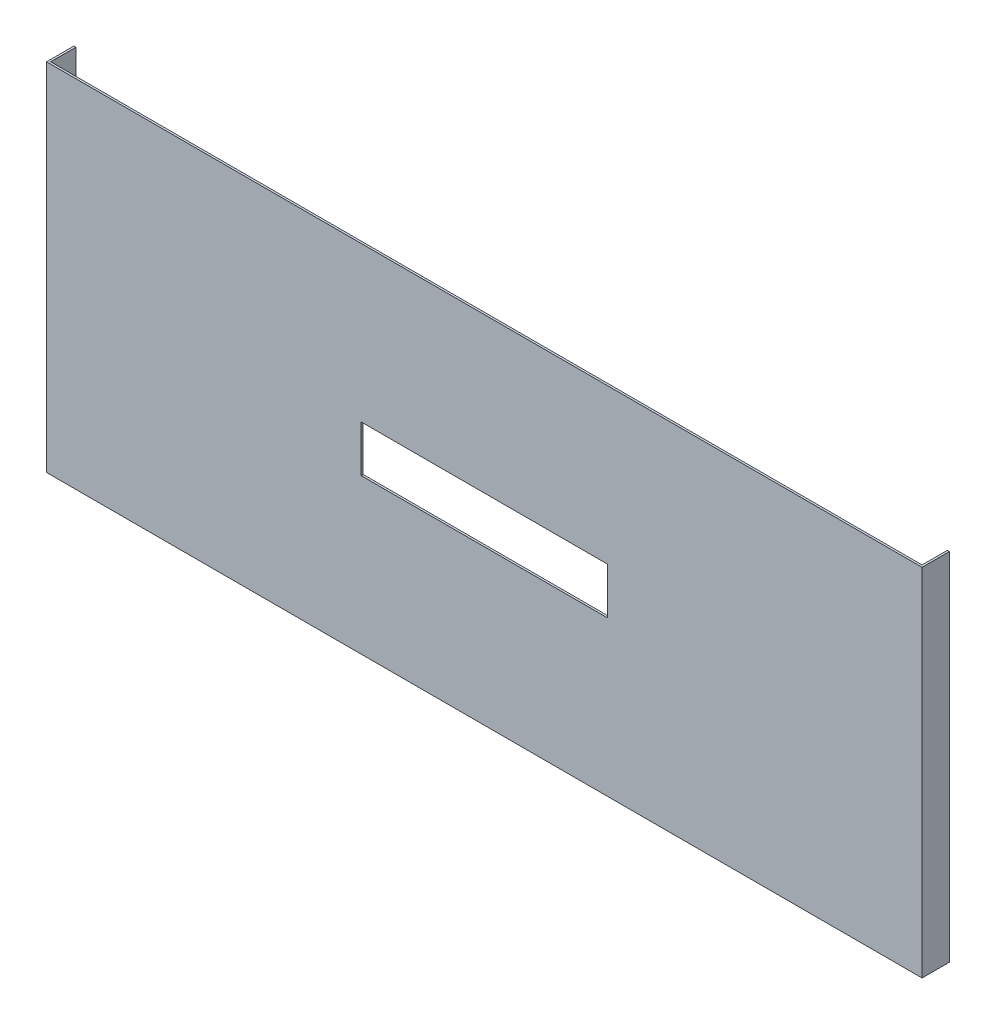
ISO-10303-21;
HEADER;
FILE_DESCRIPTION(('STEP AP214'),'2;1');
FILE_NAME('part.step','',(''),(''),'','','');
FILE_SCHEMA(('AUTOMOTIVE_DESIGN { 1 0 10303 214 1 1 1 1 }'));
ENDSEC;
DATA;
#1=APPLICATION_CONTEXT('core data for automotive mechanical design processes');
#2=APPLICATION_PROTOCOL_DEFINITION('international standard','automotive_design',2000,#1);
#3=PRODUCT_CONTEXT('',#1,'mechanical');
#4=PRODUCT('Part','Part','',(#3));
#5=PRODUCT_RELATED_PRODUCT_CATEGORY('part','',(#4));
#6=PRODUCT_DEFINITION_FORMATION('','',#4);
#7=PRODUCT_DEFINITION_CONTEXT('part definition',#1,'design');
#8=PRODUCT_DEFINITION('design','',#6,#7);
#9=PRODUCT_DEFINITION_SHAPE('','',#8);
#10=(LENGTH_UNIT() NAMED_UNIT(*) SI_UNIT(.MILLI.,.METRE.));
#11=(NAMED_UNIT(*) PLANE_ANGLE_UNIT() SI_UNIT($,.RADIAN.));
#12=(NAMED_UNIT(*) SI_UNIT($,.STERADIAN.) SOLID_ANGLE_UNIT());
#13=UNCERTAINTY_MEASURE_WITH_UNIT(LENGTH_MEASURE(1.E-05),#10,'distance_accuracy_value','');
#14=(GEOMETRIC_REPRESENTATION_CONTEXT(3) GLOBAL_UNCERTAINTY_ASSIGNED_CONTEXT((#13)) GLOBAL_UNIT_ASSIGNED_CONTEXT((#10,
#11,#12)) REPRESENTATION_CONTEXT('',''));
#15=CARTESIAN_POINT('',(0.,0.,0.));
#16=DIRECTION('',(0.,0.,1.));
#17=DIRECTION('',(1.,0.,0.));
#18=AXIS2_PLACEMENT_3D('',#15,#16,#17);
#19=CARTESIAN_POINT('',(670.,460.,40.));
#20=DIRECTION('',(0.,0.,-1.));
#21=DIRECTION('',(-1.,0.,0.));
#22=AXIS2_PLACEMENT_3D('',#19,#20,#21);
#23=PLANE('',#22);
#24=DIRECTION('',(1.,0.,0.));
#25=VECTOR('',#24,1.);
#26=CARTESIAN_POINT('',(670.,200.,40.));
#27=LINE('',#26,#25);
#28=CARTESIAN_POINT('',(30.,200.,40.));
#29=VERTEX_POINT('',#28);
#30=CARTESIAN_POINT('',(670.,200.,40.));
#31=VERTEX_POINT('',#30);
#32=EDGE_CURVE('E141',#29,#31,#27,.T.);
#33=ORIENTED_EDGE('',*,*,#32,.T.);
#34=DIRECTION('',(0.,-1.,0.));
#35=VECTOR('',#34,1.);
#36=CARTESIAN_POINT('',(670.,460.,40.));
#37=LINE('',#36,#35);
#38=CARTESIAN_POINT('',(670.,460.,40.));
#39=VERTEX_POINT('',#38);
#40=EDGE_CURVE('E200',#39,#31,#37,.T.);
#41=ORIENTED_EDGE('',*,*,#40,.F.);
#42=DIRECTION('',(1.,0.,0.));
#43=VECTOR('',#42,1.);
#44=CARTESIAN_POINT('',(670.,460.,40.));
#45=LINE('',#44,#43);
#46=CARTESIAN_POINT('',(30.,460.,40.));
#47=VERTEX_POINT('',#46);
#48=EDGE_CURVE('E149',#47,#39,#45,.T.);
#49=ORIENTED_EDGE('',*,*,#48,.F.);
#50=DIRECTION('',(0.,-1.,0.));
#51=VECTOR('',#50,1.);
#52=CARTESIAN_POINT('',(30.,460.,40.));
#53=LINE('',#52,#51);
#54=EDGE_CURVE('E166',#47,#29,#53,.T.);
#55=ORIENTED_EDGE('',*,*,#54,.T.);
#56=EDGE_LOOP('',(#33,#41,#49,#55));
#57=FACE_BOUND('',#56,.T.);
#58=DIRECTION('',(0.,-1.,0.));
#59=VECTOR('',#58,1.);
#60=CARTESIAN_POINT('',(260.,460.,40.));
#61=LINE('',#60,#59);
#62=CARTESIAN_POINT('',(260.,347.,40.));
#63=VERTEX_POINT('',#62);
#64=CARTESIAN_POINT('',(260.,313.,40.));
#65=VERTEX_POINT('',#64);
#66=EDGE_CURVE('E134',#63,#65,#61,.T.);
#67=ORIENTED_EDGE('',*,*,#66,.F.);
#68=DIRECTION('',(-1.,0.,0.));
#69=VECTOR('',#68,1.);
#70=CARTESIAN_POINT('',(670.,347.,40.));
#71=LINE('',#70,#69);
#72=CARTESIAN_POINT('',(440.,347.,40.));
#73=VERTEX_POINT('',#72);
#74=EDGE_CURVE('E123',#73,#63,#71,.T.);
#75=ORIENTED_EDGE('',*,*,#74,.F.);
#76=DIRECTION('',(0.,1.,0.));
#77=VECTOR('',#76,1.);
#78=CARTESIAN_POINT('',(440.,460.,40.));
#79=LINE('',#78,#77);
#80=CARTESIAN_POINT('',(440.,313.,40.));
#81=VERTEX_POINT('',#80);
#82=EDGE_CURVE('E128',#81,#73,#79,.T.);
#83=ORIENTED_EDGE('',*,*,#82,.F.);
#84=DIRECTION('',(1.,0.,0.));
#85=VECTOR('',#84,1.);
#86=CARTESIAN_POINT('',(670.,313.,40.));
#87=LINE('',#86,#85);
#88=EDGE_CURVE('E140',#65,#81,#87,.T.);
#89=ORIENTED_EDGE('',*,*,#88,.F.);
#90=EDGE_LOOP('',(#67,#75,#83,#89));
#91=FACE_BOUND('',#90,.T.);
#92=ADVANCED_FACE('F39',(#57,#91),#23,.F.);
#93=CARTESIAN_POINT('',(31.5,460.,38.5));
#94=DIRECTION('',(0.,0.,1.));
#95=DIRECTION('',(1.,0.,0.));
#96=AXIS2_PLACEMENT_3D('',#93,#94,#95);
#97=PLANE('',#96);
#98=DIRECTION('',(-1.,0.,0.));
#99=VECTOR('',#98,1.);
#100=CARTESIAN_POINT('',(31.5,200.,38.5));
#101=LINE('',#100,#99);
#102=CARTESIAN_POINT('',(668.5,200.,38.5));
#103=VERTEX_POINT('',#102);
#104=CARTESIAN_POINT('',(31.5,200.,38.5));
#105=VERTEX_POINT('',#104);
#106=EDGE_CURVE('E173',#103,#105,#101,.T.);
#107=ORIENTED_EDGE('',*,*,#106,.T.);
#108=DIRECTION('',(0.,-1.,0.));
#109=VECTOR('',#108,1.);
#110=CARTESIAN_POINT('',(31.5,460.,38.5));
#111=LINE('',#110,#109);
#112=CARTESIAN_POINT('',(31.5,460.,38.5));
#113=VERTEX_POINT('',#112);
#114=EDGE_CURVE('E188',#113,#105,#111,.T.);
#115=ORIENTED_EDGE('',*,*,#114,.F.);
#116=DIRECTION('',(-1.,0.,0.));
#117=VECTOR('',#116,1.);
#118=CARTESIAN_POINT('',(31.5,460.,38.5));
#119=LINE('',#118,#117);
#120=CARTESIAN_POINT('',(668.5,460.,38.5));
#121=VERTEX_POINT('',#120);
#122=EDGE_CURVE('E159',#121,#113,#119,.T.);
#123=ORIENTED_EDGE('',*,*,#122,.F.);
#124=DIRECTION('',(0.,-1.,0.));
#125=VECTOR('',#124,1.);
#126=CARTESIAN_POINT('',(668.5,460.,38.5));
#127=LINE('',#126,#125);
#128=EDGE_CURVE('E191',#121,#103,#127,.T.);
#129=ORIENTED_EDGE('',*,*,#128,.T.);
#130=EDGE_LOOP('',(#107,#115,#123,#129));
#131=FACE_BOUND('',#130,.T.);
#132=DIRECTION('',(0.,1.,0.));
#133=VECTOR('',#132,1.);
#134=CARTESIAN_POINT('',(260.,460.,38.5));
#135=LINE('',#134,#133);
#136=CARTESIAN_POINT('',(260.,313.,38.5));
#137=VERTEX_POINT('',#136);
#138=CARTESIAN_POINT('',(260.,347.,38.5));
#139=VERTEX_POINT('',#138);
#140=EDGE_CURVE('E11',#137,#139,#135,.T.);
#141=ORIENTED_EDGE('',*,*,#140,.F.);
#142=DIRECTION('',(-1.,0.,0.));
#143=VECTOR('',#142,1.);
#144=CARTESIAN_POINT('',(31.5,313.,38.5));
#145=LINE('',#144,#143);
#146=CARTESIAN_POINT('',(440.,313.,38.5));
#147=VERTEX_POINT('',#146);
#148=EDGE_CURVE('E46',#147,#137,#145,.T.);
#149=ORIENTED_EDGE('',*,*,#148,.F.);
#150=DIRECTION('',(0.,-1.,0.));
#151=VECTOR('',#150,1.);
#152=CARTESIAN_POINT('',(440.,460.,38.5));
#153=LINE('',#152,#151);
#154=CARTESIAN_POINT('',(440.,347.,38.5));
#155=VERTEX_POINT('',#154);
#156=EDGE_CURVE('E205',#155,#147,#153,.T.);
#157=ORIENTED_EDGE('',*,*,#156,.F.);
#158=DIRECTION('',(1.,0.,0.));
#159=VECTOR('',#158,1.);
#160=CARTESIAN_POINT('',(31.5,347.,38.5));
#161=LINE('',#160,#159);
#162=EDGE_CURVE('E203',#139,#155,#161,.T.);
#163=ORIENTED_EDGE('',*,*,#162,.F.);
#164=EDGE_LOOP('',(#141,#149,#157,#163));
#165=FACE_BOUND('',#164,.T.);
#166=ADVANCED_FACE('F215',(#131,#165),#97,.F.);
#167=CARTESIAN_POINT('',(670.,460.,20.));
#168=DIRECTION('',(-1.,0.,0.));
#169=DIRECTION('',(0.,0.,1.));
#170=AXIS2_PLACEMENT_3D('',#167,#168,#169);
#171=PLANE('',#170);
#172=DIRECTION('',(0.,0.,-1.));
#173=VECTOR('',#172,1.);
#174=CARTESIAN_POINT('',(670.,200.,20.));
#175=LINE('',#174,#173);
#176=CARTESIAN_POINT('',(670.,200.,20.));
#177=VERTEX_POINT('',#176);
#178=EDGE_CURVE('E144',#31,#177,#175,.T.);
#179=ORIENTED_EDGE('',*,*,#178,.T.);
#180=DIRECTION('',(0.,-1.,0.));
#181=VECTOR('',#180,1.);
#182=CARTESIAN_POINT('',(670.,460.,20.));
#183=LINE('',#182,#181);
#184=CARTESIAN_POINT('',(670.,460.,20.));
#185=VERTEX_POINT('',#184);
#186=EDGE_CURVE('E197',#185,#177,#183,.T.);
#187=ORIENTED_EDGE('',*,*,#186,.F.);
#188=DIRECTION('',(0.,0.,-1.));
#189=VECTOR('',#188,1.);
#190=CARTESIAN_POINT('',(670.,460.,20.));
#191=LINE('',#190,#189);
#192=EDGE_CURVE('E152',#39,#185,#191,.T.);
#193=ORIENTED_EDGE('',*,*,#192,.F.);
#194=ORIENTED_EDGE('',*,*,#40,.T.);
#195=EDGE_LOOP('',(#179,#187,#193,#194));
#196=FACE_BOUND('',#195,.T.);
#197=ADVANCED_FACE('F234',(#196),#171,.F.);
#198=CARTESIAN_POINT('',(668.5,460.,20.));
#199=DIRECTION('',(0.,0.,1.));
#200=DIRECTION('',(1.,0.,0.));
#201=AXIS2_PLACEMENT_3D('',#198,#199,#200);
#202=PLANE('',#201);
#203=DIRECTION('',(-1.,0.,0.));
#204=VECTOR('',#203,1.);
#205=CARTESIAN_POINT('',(668.5,200.,20.));
#206=LINE('',#205,#204);
#207=CARTESIAN_POINT('',(668.5,200.,20.));
#208=VERTEX_POINT('',#207);
#209=EDGE_CURVE('E169',#177,#208,#206,.T.);
#210=ORIENTED_EDGE('',*,*,#209,.T.);
#211=DIRECTION('',(0.,-1.,0.));
#212=VECTOR('',#211,1.);
#213=CARTESIAN_POINT('',(668.5,460.,20.));
#214=LINE('',#213,#212);
#215=CARTESIAN_POINT('',(668.5,460.,20.));
#216=VERTEX_POINT('',#215);
#217=EDGE_CURVE('E194',#216,#208,#214,.T.);
#218=ORIENTED_EDGE('',*,*,#217,.F.);
#219=DIRECTION('',(-1.,0.,0.));
#220=VECTOR('',#219,1.);
#221=CARTESIAN_POINT('',(668.5,460.,20.));
#222=LINE('',#221,#220);
#223=EDGE_CURVE('E155',#185,#216,#222,.T.);
#224=ORIENTED_EDGE('',*,*,#223,.F.);
#225=ORIENTED_EDGE('',*,*,#186,.T.);
#226=EDGE_LOOP('',(#210,#218,#224,#225));
#227=FACE_BOUND('',#226,.T.);
#228=ADVANCED_FACE('F273',(#227),#202,.F.);
#229=CARTESIAN_POINT('',(668.5,460.,38.5));
#230=DIRECTION('',(1.,0.,0.));
#231=DIRECTION('',(0.,0.,-1.));
#232=AXIS2_PLACEMENT_3D('',#229,#230,#231);
#233=PLANE('',#232);
#234=DIRECTION('',(0.,0.,1.));
#235=VECTOR('',#234,1.);
#236=CARTESIAN_POINT('',(668.5,200.,38.5));
#237=LINE('',#236,#235);
#238=EDGE_CURVE('E171',#208,#103,#237,.T.);
#239=ORIENTED_EDGE('',*,*,#238,.T.);
#240=ORIENTED_EDGE('',*,*,#128,.F.);
#241=DIRECTION('',(0.,0.,1.));
#242=VECTOR('',#241,1.);
#243=CARTESIAN_POINT('',(668.5,460.,38.5));
#244=LINE('',#243,#242);
#245=EDGE_CURVE('E157',#216,#121,#244,.T.);
#246=ORIENTED_EDGE('',*,*,#245,.F.);
#247=ORIENTED_EDGE('',*,*,#217,.T.);
#248=EDGE_LOOP('',(#239,#240,#246,#247));
#249=FACE_BOUND('',#248,.T.);
#250=ADVANCED_FACE('F270',(#249),#233,.F.);
#251=CARTESIAN_POINT('',(31.5,460.,20.));
#252=DIRECTION('',(-1.,0.,0.));
#253=DIRECTION('',(0.,0.,1.));
#254=AXIS2_PLACEMENT_3D('',#251,#252,#253);
#255=PLANE('',#254);
#256=DIRECTION('',(0.,0.,-1.));
#257=VECTOR('',#256,1.);
#258=CARTESIAN_POINT('',(31.5,200.,20.));
#259=LINE('',#258,#257);
#260=CARTESIAN_POINT('',(31.5,200.,20.));
#261=VERTEX_POINT('',#260);
#262=EDGE_CURVE('E175',#105,#261,#259,.T.);
#263=ORIENTED_EDGE('',*,*,#262,.T.);
#264=DIRECTION('',(0.,-1.,0.));
#265=VECTOR('',#264,1.);
#266=CARTESIAN_POINT('',(31.5,460.,20.));
#267=LINE('',#266,#265);
#268=CARTESIAN_POINT('',(31.5,460.,20.));
#269=VERTEX_POINT('',#268);
#270=EDGE_CURVE('E185',#269,#261,#267,.T.);
#271=ORIENTED_EDGE('',*,*,#270,.F.);
#272=DIRECTION('',(0.,0.,-1.));
#273=VECTOR('',#272,1.);
#274=CARTESIAN_POINT('',(31.5,460.,20.));
#275=LINE('',#274,#273);
#276=EDGE_CURVE('E161',#113,#269,#275,.T.);
#277=ORIENTED_EDGE('',*,*,#276,.F.);
#278=ORIENTED_EDGE('',*,*,#114,.T.);
#279=EDGE_LOOP('',(#263,#271,#277,#278));
#280=FACE_BOUND('',#279,.T.);
#281=ADVANCED_FACE('F263',(#280),#255,.F.);
#282=CARTESIAN_POINT('',(30.,460.,20.));
#283=DIRECTION('',(0.,0.,1.));
#284=DIRECTION('',(1.,0.,0.));
#285=AXIS2_PLACEMENT_3D('',#282,#283,#284);
#286=PLANE('',#285);
#287=DIRECTION('',(-1.,0.,0.));
#288=VECTOR('',#287,1.);
#289=CARTESIAN_POINT('',(30.,200.,20.));
#290=LINE('',#289,#288);
#291=CARTESIAN_POINT('',(30.,200.,20.));
#292=VERTEX_POINT('',#291);
#293=EDGE_CURVE('E177',#261,#292,#290,.T.);
#294=ORIENTED_EDGE('',*,*,#293,.T.);
#295=DIRECTION('',(0.,-1.,0.));
#296=VECTOR('',#295,1.);
#297=CARTESIAN_POINT('',(30.,460.,20.));
#298=LINE('',#297,#296);
#299=CARTESIAN_POINT('',(30.,460.,20.));
#300=VERTEX_POINT('',#299);
#301=EDGE_CURVE('E182',#300,#292,#298,.T.);
#302=ORIENTED_EDGE('',*,*,#301,.F.);
#303=DIRECTION('',(-1.,0.,0.));
#304=VECTOR('',#303,1.);
#305=CARTESIAN_POINT('',(30.,460.,20.));
#306=LINE('',#305,#304);
#307=EDGE_CURVE('E163',#269,#300,#306,.T.);
#308=ORIENTED_EDGE('',*,*,#307,.F.);
#309=ORIENTED_EDGE('',*,*,#270,.T.);
#310=EDGE_LOOP('',(#294,#302,#308,#309));
#311=FACE_BOUND('',#310,.T.);
#312=ADVANCED_FACE('F258',(#311),#286,.F.);
#313=CARTESIAN_POINT('',(30.,460.,40.));
#314=DIRECTION('',(1.,0.,0.));
#315=DIRECTION('',(0.,0.,-1.));
#316=AXIS2_PLACEMENT_3D('',#313,#314,#315);
#317=PLANE('',#316);
#318=DIRECTION('',(0.,0.,1.));
#319=VECTOR('',#318,1.);
#320=CARTESIAN_POINT('',(30.,200.,40.));
#321=LINE('',#320,#319);
#322=EDGE_CURVE('E153',#292,#29,#321,.T.);
#323=ORIENTED_EDGE('',*,*,#322,.T.);
#324=ORIENTED_EDGE('',*,*,#54,.F.);
#325=DIRECTION('',(0.,0.,1.));
#326=VECTOR('',#325,1.);
#327=CARTESIAN_POINT('',(30.,460.,40.));
#328=LINE('',#327,#326);
#329=EDGE_CURVE('E165',#300,#47,#328,.T.);
#330=ORIENTED_EDGE('',*,*,#329,.F.);
#331=ORIENTED_EDGE('',*,*,#301,.T.);
#332=EDGE_LOOP('',(#323,#324,#330,#331));
#333=FACE_BOUND('',#332,.T.);
#334=ADVANCED_FACE('F256',(#333),#317,.F.);
#335=CARTESIAN_POINT('',(0.,460.,0.));
#336=DIRECTION('',(0.,-1.,0.));
#337=DIRECTION('',(0.,0.,-1.));
#338=AXIS2_PLACEMENT_3D('',#335,#336,#337);
#339=PLANE('',#338);
#340=ORIENTED_EDGE('',*,*,#48,.T.);
#341=ORIENTED_EDGE('',*,*,#192,.T.);
#342=ORIENTED_EDGE('',*,*,#223,.T.);
#343=ORIENTED_EDGE('',*,*,#245,.T.);
#344=ORIENTED_EDGE('',*,*,#122,.T.);
#345=ORIENTED_EDGE('',*,*,#276,.T.);
#346=ORIENTED_EDGE('',*,*,#307,.T.);
#347=ORIENTED_EDGE('',*,*,#329,.T.);
#348=EDGE_LOOP('',(#340,#341,#342,#343,#344,#345,#346,#347));
#349=FACE_BOUND('',#348,.T.);
#350=ADVANCED_FACE('F251',(#349),#339,.F.);
#351=CARTESIAN_POINT('',(0.,200.,0.));
#352=DIRECTION('',(0.,-1.,0.));
#353=DIRECTION('',(0.,0.,-1.));
#354=AXIS2_PLACEMENT_3D('',#351,#352,#353);
#355=PLANE('',#354);
#356=ORIENTED_EDGE('',*,*,#32,.F.);
#357=ORIENTED_EDGE('',*,*,#322,.F.);
#358=ORIENTED_EDGE('',*,*,#293,.F.);
#359=ORIENTED_EDGE('',*,*,#262,.F.);
#360=ORIENTED_EDGE('',*,*,#106,.F.);
#361=ORIENTED_EDGE('',*,*,#238,.F.);
#362=ORIENTED_EDGE('',*,*,#209,.F.);
#363=ORIENTED_EDGE('',*,*,#178,.F.);
#364=EDGE_LOOP('',(#356,#357,#358,#359,#360,#361,#362,#363));
#365=FACE_BOUND('',#364,.T.);
#366=ADVANCED_FACE('F243',(#365),#355,.T.);
#367=CARTESIAN_POINT('',(260.,313.,41.));
#368=DIRECTION('',(1.,0.,0.));
#369=DIRECTION('',(0.,0.,-1.));
#370=AXIS2_PLACEMENT_3D('',#367,#368,#369);
#371=PLANE('',#370);
#372=ORIENTED_EDGE('',*,*,#66,.T.);
#373=DIRECTION('',(0.,0.,-1.));
#374=VECTOR('',#373,1.);
#375=CARTESIAN_POINT('',(260.,313.,41.));
#376=LINE('',#375,#374);
#377=EDGE_CURVE('E129',#65,#137,#376,.T.);
#378=ORIENTED_EDGE('',*,*,#377,.T.);
#379=ORIENTED_EDGE('',*,*,#140,.T.);
#380=DIRECTION('',(0.,0.,-1.));
#381=VECTOR('',#380,1.);
#382=CARTESIAN_POINT('',(260.,347.,41.));
#383=LINE('',#382,#381);
#384=EDGE_CURVE('E58',#63,#139,#383,.T.);
#385=ORIENTED_EDGE('',*,*,#384,.F.);
#386=EDGE_LOOP('',(#372,#378,#379,#385));
#387=FACE_BOUND('',#386,.T.);
#388=ADVANCED_FACE('F132',(#387),#371,.T.);
#389=CARTESIAN_POINT('',(260.,313.,41.));
#390=DIRECTION('',(0.,1.,0.));
#391=DIRECTION('',(0.,0.,1.));
#392=AXIS2_PLACEMENT_3D('',#389,#390,#391);
#393=PLANE('',#392);
#394=ORIENTED_EDGE('',*,*,#88,.T.);
#395=DIRECTION('',(0.,0.,-1.));
#396=VECTOR('',#395,1.);
#397=CARTESIAN_POINT('',(440.,313.,41.));
#398=LINE('',#397,#396);
#399=EDGE_CURVE('E211',#81,#147,#398,.T.);
#400=ORIENTED_EDGE('',*,*,#399,.T.);
#401=ORIENTED_EDGE('',*,*,#148,.T.);
#402=ORIENTED_EDGE('',*,*,#377,.F.);
#403=EDGE_LOOP('',(#394,#400,#401,#402));
#404=FACE_BOUND('',#403,.T.);
#405=ADVANCED_FACE('F209',(#404),#393,.T.);
#406=CARTESIAN_POINT('',(440.,313.,41.));
#407=DIRECTION('',(-1.,0.,0.));
#408=DIRECTION('',(0.,0.,1.));
#409=AXIS2_PLACEMENT_3D('',#406,#407,#408);
#410=PLANE('',#409);
#411=ORIENTED_EDGE('',*,*,#82,.T.);
#412=DIRECTION('',(0.,0.,-1.));
#413=VECTOR('',#412,1.);
#414=CARTESIAN_POINT('',(440.,347.,41.));
#415=LINE('',#414,#413);
#416=EDGE_CURVE('E53',#73,#155,#415,.T.);
#417=ORIENTED_EDGE('',*,*,#416,.T.);
#418=ORIENTED_EDGE('',*,*,#156,.T.);
#419=ORIENTED_EDGE('',*,*,#399,.F.);
#420=EDGE_LOOP('',(#411,#417,#418,#419));
#421=FACE_BOUND('',#420,.T.);
#422=ADVANCED_FACE('F217',(#421),#410,.T.);
#423=CARTESIAN_POINT('',(260.,347.,41.));
#424=DIRECTION('',(0.,-1.,0.));
#425=DIRECTION('',(0.,0.,-1.));
#426=AXIS2_PLACEMENT_3D('',#423,#424,#425);
#427=PLANE('',#426);
#428=ORIENTED_EDGE('',*,*,#74,.T.);
#429=ORIENTED_EDGE('',*,*,#384,.T.);
#430=ORIENTED_EDGE('',*,*,#162,.T.);
#431=ORIENTED_EDGE('',*,*,#416,.F.);
#432=EDGE_LOOP('',(#428,#429,#430,#431));
#433=FACE_BOUND('',#432,.T.);
#434=ADVANCED_FACE('F124',(#433),#427,.T.);
#435=CLOSED_SHELL('',(#92,#166,#197,#228,#250,#281,#312,#334,#350,#366,#388,#405,#422,#434));
#436=MANIFOLD_SOLID_BREP('B2',#435);
#437=ADVANCED_BREP_SHAPE_REPRESENTATION('',(#18,#436),#14);
#438=SHAPE_DEFINITION_REPRESENTATION(#9,#437);
ENDSEC;
END-ISO-10303-21;
